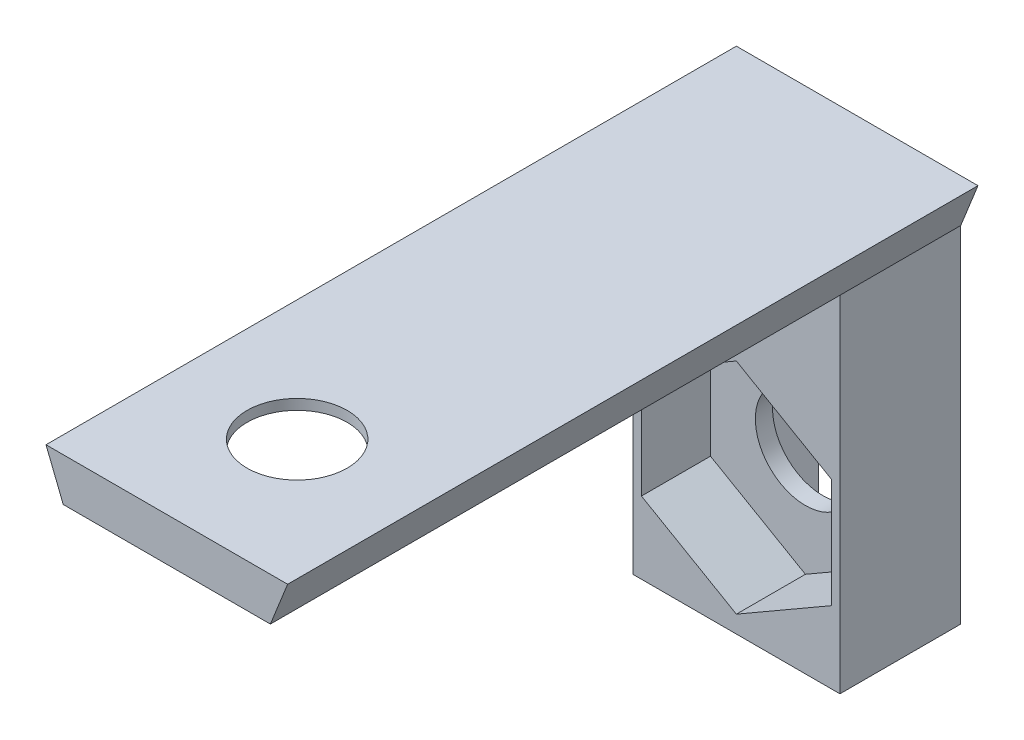
ISO-10303-21;
HEADER;
FILE_DESCRIPTION(('STEP AP214'),'2;1');
FILE_NAME('part.step','',(''),(''),'','','');
FILE_SCHEMA(('AUTOMOTIVE_DESIGN { 1 0 10303 214 1 1 1 1 }'));
ENDSEC;
DATA;
#1=APPLICATION_CONTEXT('core data for automotive mechanical design processes');
#2=APPLICATION_PROTOCOL_DEFINITION('international standard','automotive_design',2000,#1);
#3=PRODUCT_CONTEXT('',#1,'mechanical');
#4=PRODUCT('Part','Part','',(#3));
#5=PRODUCT_RELATED_PRODUCT_CATEGORY('part','',(#4));
#6=PRODUCT_DEFINITION_FORMATION('','',#4);
#7=PRODUCT_DEFINITION_CONTEXT('part definition',#1,'design');
#8=PRODUCT_DEFINITION('design','',#6,#7);
#9=PRODUCT_DEFINITION_SHAPE('','',#8);
#10=(LENGTH_UNIT() NAMED_UNIT(*) SI_UNIT(.MILLI.,.METRE.));
#11=(NAMED_UNIT(*) PLANE_ANGLE_UNIT() SI_UNIT($,.RADIAN.));
#12=(NAMED_UNIT(*) SI_UNIT($,.STERADIAN.) SOLID_ANGLE_UNIT());
#13=UNCERTAINTY_MEASURE_WITH_UNIT(LENGTH_MEASURE(1.E-05),#10,'distance_accuracy_value','');
#14=(GEOMETRIC_REPRESENTATION_CONTEXT(3) GLOBAL_UNCERTAINTY_ASSIGNED_CONTEXT((#13)) GLOBAL_UNIT_ASSIGNED_CONTEXT((#10,
#11,#12)) REPRESENTATION_CONTEXT('',''));
#15=CARTESIAN_POINT('',(0.,0.,0.));
#16=DIRECTION('',(0.,0.,1.));
#17=DIRECTION('',(1.,0.,0.));
#18=AXIS2_PLACEMENT_3D('',#15,#16,#17);
#19=CARTESIAN_POINT('',(0.,7.35,-3.501));
#20=DIRECTION('',(0.,0.,1.));
#21=DIRECTION('',(1.,0.,0.));
#22=AXIS2_PLACEMENT_3D('',#19,#20,#21);
#23=CYLINDRICAL_SURFACE('',#22,2.9);
#24=CARTESIAN_POINT('',(0.,7.35,-1.5));
#25=DIRECTION('',(0.,0.,1.));
#26=DIRECTION('',(1.,0.,0.));
#27=AXIS2_PLACEMENT_3D('',#24,#25,#26);
#28=CIRCLE('',#27,2.9);
#29=CARTESIAN_POINT('',(2.9,7.35,-1.5));
#30=VERTEX_POINT('',#29);
#31=EDGE_CURVE('E379',#30,#30,#28,.F.);
#32=CARTESIAN_POINT('',(0.,7.35,-0.500000000000002));
#33=DIRECTION('',(0.,0.,1.));
#34=DIRECTION('',(1.,0.,0.));
#35=AXIS2_PLACEMENT_3D('',#32,#33,#34);
#36=CIRCLE('',#35,2.9);
#37=CARTESIAN_POINT('',(2.9,7.35,-0.500000000000003));
#38=VERTEX_POINT('',#37);
#39=EDGE_CURVE('E43',#38,#38,#36,.F.);
#40=CARTESIAN_POINT('',(2.9,7.35,-1.5));
#41=CARTESIAN_POINT('',(2.9,7.35,-1.48958333333334));
#42=CARTESIAN_POINT('',(2.9,7.35,-1.47916666666667));
#43=CARTESIAN_POINT('',(2.9,7.35,-1.45833333333334));
#44=CARTESIAN_POINT('',(2.9,7.35,-1.44791666666667));
#45=CARTESIAN_POINT('',(2.9,7.35,-1.42708333333334));
#46=CARTESIAN_POINT('',(2.9,7.35,-1.41666666666667));
#47=CARTESIAN_POINT('',(2.9,7.35,-1.39583333333334));
#48=CARTESIAN_POINT('',(2.9,7.35,-1.38541666666667));
#49=CARTESIAN_POINT('',(2.9,7.35,-1.36458333333334));
#50=CARTESIAN_POINT('',(2.9,7.35,-1.35416666666667));
#51=CARTESIAN_POINT('',(2.9,7.35,-1.33333333333334));
#52=CARTESIAN_POINT('',(2.9,7.35,-1.32291666666667));
#53=CARTESIAN_POINT('',(2.9,7.35,-1.30208333333334));
#54=CARTESIAN_POINT('',(2.9,7.35,-1.29166666666667));
#55=CARTESIAN_POINT('',(2.9,7.35,-1.27083333333334));
#56=CARTESIAN_POINT('',(2.9,7.35,-1.26041666666667));
#57=CARTESIAN_POINT('',(2.9,7.35,-1.23958333333334));
#58=CARTESIAN_POINT('',(2.9,7.35,-1.22916666666667));
#59=CARTESIAN_POINT('',(2.9,7.35,-1.20833333333334));
#60=CARTESIAN_POINT('',(2.9,7.35,-1.19791666666667));
#61=CARTESIAN_POINT('',(2.9,7.35,-1.17708333333334));
#62=CARTESIAN_POINT('',(2.9,7.35,-1.16666666666667));
#63=CARTESIAN_POINT('',(2.9,7.35,-1.14583333333334));
#64=CARTESIAN_POINT('',(2.9,7.35,-1.13541666666667));
#65=CARTESIAN_POINT('',(2.9,7.35,-1.11458333333334));
#66=CARTESIAN_POINT('',(2.9,7.35,-1.10416666666667));
#67=CARTESIAN_POINT('',(2.9,7.35,-1.08333333333334));
#68=CARTESIAN_POINT('',(2.9,7.35,-1.07291666666667));
#69=CARTESIAN_POINT('',(2.9,7.35,-1.05208333333334));
#70=CARTESIAN_POINT('',(2.9,7.35,-1.04166666666667));
#71=CARTESIAN_POINT('',(2.9,7.35,-1.02083333333334));
#72=CARTESIAN_POINT('',(2.9,7.35,-1.01041666666667));
#73=CARTESIAN_POINT('',(2.9,7.35,-0.989583333333336));
#74=CARTESIAN_POINT('',(2.9,7.35,-0.979166666666669));
#75=CARTESIAN_POINT('',(2.9,7.35,-0.958333333333335));
#76=CARTESIAN_POINT('',(2.9,7.35,-0.947916666666669));
#77=CARTESIAN_POINT('',(2.9,7.35,-0.927083333333335));
#78=CARTESIAN_POINT('',(2.9,7.35,-0.916666666666669));
#79=CARTESIAN_POINT('',(2.9,7.35,-0.895833333333335));
#80=CARTESIAN_POINT('',(2.9,7.35,-0.885416666666669));
#81=CARTESIAN_POINT('',(2.9,7.35,-0.864583333333335));
#82=CARTESIAN_POINT('',(2.9,7.35,-0.854166666666669));
#83=CARTESIAN_POINT('',(2.9,7.35,-0.833333333333336));
#84=CARTESIAN_POINT('',(2.9,7.35,-0.822916666666669));
#85=CARTESIAN_POINT('',(2.9,7.35,-0.802083333333336));
#86=CARTESIAN_POINT('',(2.9,7.35,-0.791666666666669));
#87=CARTESIAN_POINT('',(2.9,7.35,-0.770833333333336));
#88=CARTESIAN_POINT('',(2.9,7.35,-0.760416666666669));
#89=CARTESIAN_POINT('',(2.9,7.35,-0.739583333333336));
#90=CARTESIAN_POINT('',(2.9,7.35,-0.729166666666669));
#91=CARTESIAN_POINT('',(2.9,7.35,-0.708333333333336));
#92=CARTESIAN_POINT('',(2.9,7.35,-0.697916666666669));
#93=CARTESIAN_POINT('',(2.9,7.35,-0.677083333333336));
#94=CARTESIAN_POINT('',(2.9,7.35,-0.666666666666669));
#95=CARTESIAN_POINT('',(2.9,7.35,-0.645833333333336));
#96=CARTESIAN_POINT('',(2.9,7.35,-0.635416666666669));
#97=CARTESIAN_POINT('',(2.9,7.35,-0.614583333333336));
#98=CARTESIAN_POINT('',(2.9,7.35,-0.604166666666669));
#99=CARTESIAN_POINT('',(2.9,7.35,-0.583333333333336));
#100=CARTESIAN_POINT('',(2.9,7.35,-0.572916666666669));
#101=CARTESIAN_POINT('',(2.9,7.35,-0.552083333333336));
#102=CARTESIAN_POINT('',(2.9,7.35,-0.541666666666669));
#103=CARTESIAN_POINT('',(2.9,7.35,-0.520833333333336));
#104=CARTESIAN_POINT('',(2.9,7.35,-0.510416666666669));
#105=CARTESIAN_POINT('',(2.9,7.35,-0.500000000000003));
#106=B_SPLINE_CURVE_WITH_KNOTS('',3,(#40,#41,#42,#43,#44,#45,#46,#47,#48,#49,#50,#51,#52,#53,
#54,#55,#56,#57,#58,#59,#60,#61,#62,#63,#64,#65,#66,#67,#68,#69,#70,#71,#72,#73,#74,#75,#76,#77,
#78,#79,#80,#81,#82,#83,#84,#85,#86,#87,#88,#89,#90,#91,#92,#93,#94,#95,#96,#97,#98,#99,#100,
#101,#102,#103,#104,#105),.UNSPECIFIED.,.F.,.F.,(4,2,2,2,2,2,2,2,2,2,2,2,2,2,2,2,2,2,2,2,2,2,2,
2,2,2,2,2,2,2,2,2,4),(0.,0.03125,0.0625000000000001,0.0937500000000001,0.125,0.15625,0.1875,
0.21875,0.25,0.28125,0.3125,0.34375,0.374999999999999,0.40625,0.4375,0.46875,0.5,0.53125,0.5625,
0.59375,0.625,0.65625,0.687499999999999,0.718749999999999,0.749999999999999,0.781249999999999,
0.812499999999999,0.843749999999999,0.874999999999999,0.906249999999999,0.937499999999999,
0.968749999999999,0.999999999999999),.UNSPECIFIED.);
#107=EDGE_CURVE('BSEAM39',#30,#38,#106,.T.);
#108=ORIENTED_EDGE('',*,*,#31,.T.);
#109=ORIENTED_EDGE('',*,*,#39,.F.);
#110=ORIENTED_EDGE('',*,*,#107,.T.);
#111=ORIENTED_EDGE('',*,*,#107,.F.);
#112=EDGE_LOOP('',(#108,#110,#109,#111));
#113=FACE_BOUND('',#112,.T.);
#114=ADVANCED_FACE('F39',(#113),#23,.F.);
#115=CARTESIAN_POINT('',(6.,20.,3.5));
#116=DIRECTION('',(-1.,0.,0.));
#117=DIRECTION('',(0.,0.,1.));
#118=AXIS2_PLACEMENT_3D('',#115,#116,#117);
#119=PLANE('',#118);
#120=DIRECTION('',(0.,0.,-1.));
#121=VECTOR('',#120,1.);
#122=CARTESIAN_POINT('',(6.,0.,3.5));
#123=LINE('',#122,#121);
#124=CARTESIAN_POINT('',(6.,0.,3.5));
#125=VERTEX_POINT('',#124);
#126=CARTESIAN_POINT('',(6.,0.,-3.5));
#127=VERTEX_POINT('',#126);
#128=EDGE_CURVE('E411',#125,#127,#123,.T.);
#129=ORIENTED_EDGE('',*,*,#128,.T.);
#130=DIRECTION('',(0.,-1.,0.));
#131=VECTOR('',#130,1.);
#132=CARTESIAN_POINT('',(6.,20.,-3.5));
#133=LINE('',#132,#131);
#134=CARTESIAN_POINT('',(6.,20.,-3.5));
#135=VERTEX_POINT('',#134);
#136=EDGE_CURVE('E11',#135,#127,#133,.T.);
#137=ORIENTED_EDGE('',*,*,#136,.F.);
#138=DIRECTION('',(0.,0.,-1.));
#139=VECTOR('',#138,1.);
#140=CARTESIAN_POINT('',(6.,20.,3.5));
#141=LINE('',#140,#139);
#142=CARTESIAN_POINT('',(6.,20.,3.5));
#143=VERTEX_POINT('',#142);
#144=EDGE_CURVE('E420',#143,#135,#141,.T.);
#145=ORIENTED_EDGE('',*,*,#144,.F.);
#146=DIRECTION('',(0.,-1.,0.));
#147=VECTOR('',#146,1.);
#148=CARTESIAN_POINT('',(6.,20.,3.5));
#149=LINE('',#148,#147);
#150=EDGE_CURVE('E431',#143,#125,#149,.T.);
#151=ORIENTED_EDGE('',*,*,#150,.T.);
#152=EDGE_LOOP('',(#129,#137,#145,#151));
#153=FACE_BOUND('',#152,.T.);
#154=ADVANCED_FACE('F41',(#153),#119,.F.);
#155=CARTESIAN_POINT('',(-6.,20.,-3.5));
#156=DIRECTION('',(0.,0.,1.));
#157=DIRECTION('',(1.,0.,0.));
#158=AXIS2_PLACEMENT_3D('',#155,#156,#157);
#159=PLANE('',#158);
#160=DIRECTION('',(-1.,0.,0.));
#161=VECTOR('',#160,1.);
#162=CARTESIAN_POINT('',(-7.,22.5,-3.5));
#163=LINE('',#162,#161);
#164=CARTESIAN_POINT('',(7.,22.5,-3.5));
#165=VERTEX_POINT('',#164);
#166=CARTESIAN_POINT('',(-7.,22.5,-3.5));
#167=VERTEX_POINT('',#166);
#168=EDGE_CURVE('E305',#165,#167,#163,.T.);
#169=ORIENTED_EDGE('',*,*,#168,.F.);
#170=DIRECTION('',(0.371390676354104,0.928476690885259,0.));
#171=VECTOR('',#170,1.);
#172=CARTESIAN_POINT('',(7.,22.5,-3.5));
#173=LINE('',#172,#171);
#174=EDGE_CURVE('E273',#135,#165,#173,.T.);
#175=ORIENTED_EDGE('',*,*,#174,.F.);
#176=ORIENTED_EDGE('',*,*,#136,.T.);
#177=DIRECTION('',(-1.,0.,0.));
#178=VECTOR('',#177,1.);
#179=CARTESIAN_POINT('',(-6.,0.,-3.5));
#180=LINE('',#179,#178);
#181=CARTESIAN_POINT('',(2.25,0.,-3.5));
#182=VERTEX_POINT('',#181);
#183=EDGE_CURVE('E436',#127,#182,#180,.T.);
#184=ORIENTED_EDGE('',*,*,#183,.T.);
#185=DIRECTION('',(0.,1.,0.));
#186=VECTOR('',#185,1.);
#187=CARTESIAN_POINT('',(2.25,0.,-3.5));
#188=LINE('',#187,#186);
#189=CARTESIAN_POINT('',(2.25,20.,-3.5));
#190=VERTEX_POINT('',#189);
#191=EDGE_CURVE('E407',#182,#190,#188,.T.);
#192=ORIENTED_EDGE('',*,*,#191,.T.);
#193=DIRECTION('',(-1.,0.,0.));
#194=VECTOR('',#193,1.);
#195=CARTESIAN_POINT('',(-7.,20.,-3.5));
#196=LINE('',#195,#194);
#197=CARTESIAN_POINT('',(-2.25,20.,-3.5));
#198=VERTEX_POINT('',#197);
#199=EDGE_CURVE('E297',#190,#198,#196,.T.);
#200=ORIENTED_EDGE('',*,*,#199,.T.);
#201=DIRECTION('',(0.,1.,0.));
#202=VECTOR('',#201,1.);
#203=CARTESIAN_POINT('',(-2.25,0.,-3.5));
#204=LINE('',#203,#202);
#205=CARTESIAN_POINT('',(-2.25,0.,-3.5));
#206=VERTEX_POINT('',#205);
#207=EDGE_CURVE('E397',#206,#198,#204,.T.);
#208=ORIENTED_EDGE('',*,*,#207,.F.);
#209=CARTESIAN_POINT('',(-6.,0.,-3.5));
#210=VERTEX_POINT('',#209);
#211=EDGE_CURVE('E435',#206,#210,#180,.T.);
#212=ORIENTED_EDGE('',*,*,#211,.T.);
#213=DIRECTION('',(0.,-1.,0.));
#214=VECTOR('',#213,1.);
#215=CARTESIAN_POINT('',(-6.,20.,-3.5));
#216=LINE('',#215,#214);
#217=CARTESIAN_POINT('',(-6.,20.,-3.5));
#218=VERTEX_POINT('',#217);
#219=EDGE_CURVE('E49',#218,#210,#216,.T.);
#220=ORIENTED_EDGE('',*,*,#219,.F.);
#221=DIRECTION('',(0.371390676354104,-0.928476690885259,0.));
#222=VECTOR('',#221,1.);
#223=CARTESIAN_POINT('',(-6.,20.,-3.5));
#224=LINE('',#223,#222);
#225=EDGE_CURVE('E261',#167,#218,#224,.T.);
#226=ORIENTED_EDGE('',*,*,#225,.F.);
#227=EDGE_LOOP('',(#169,#175,#176,#184,#192,#200,#208,#212,#220,#226));
#228=FACE_BOUND('',#227,.T.);
#229=ADVANCED_FACE('F490',(#228),#159,.F.);
#230=CARTESIAN_POINT('',(-6.,20.,3.5));
#231=DIRECTION('',(1.,0.,0.));
#232=DIRECTION('',(0.,0.,-1.));
#233=AXIS2_PLACEMENT_3D('',#230,#231,#232);
#234=PLANE('',#233);
#235=DIRECTION('',(0.,0.,1.));
#236=VECTOR('',#235,1.);
#237=CARTESIAN_POINT('',(-6.,0.,3.5));
#238=LINE('',#237,#236);
#239=CARTESIAN_POINT('',(-6.,0.,3.5));
#240=VERTEX_POINT('',#239);
#241=EDGE_CURVE('E440',#210,#240,#238,.T.);
#242=ORIENTED_EDGE('',*,*,#241,.T.);
#243=DIRECTION('',(0.,-1.,0.));
#244=VECTOR('',#243,1.);
#245=CARTESIAN_POINT('',(-6.,20.,3.5));
#246=LINE('',#245,#244);
#247=CARTESIAN_POINT('',(-6.,20.,3.5));
#248=VERTEX_POINT('',#247);
#249=EDGE_CURVE('E448',#248,#240,#246,.T.);
#250=ORIENTED_EDGE('',*,*,#249,.F.);
#251=DIRECTION('',(0.,0.,1.));
#252=VECTOR('',#251,1.);
#253=CARTESIAN_POINT('',(-6.,20.,3.5));
#254=LINE('',#253,#252);
#255=EDGE_CURVE('E423',#218,#248,#254,.T.);
#256=ORIENTED_EDGE('',*,*,#255,.F.);
#257=ORIENTED_EDGE('',*,*,#219,.T.);
#258=EDGE_LOOP('',(#242,#250,#256,#257));
#259=FACE_BOUND('',#258,.T.);
#260=ADVANCED_FACE('F458',(#259),#234,.F.);
#261=CARTESIAN_POINT('',(-6.,20.,3.5));
#262=DIRECTION('',(0.,0.,-1.));
#263=DIRECTION('',(-1.,0.,0.));
#264=AXIS2_PLACEMENT_3D('',#261,#262,#263);
#265=PLANE('',#264);
#266=DIRECTION('',(-0.866025403784438,-0.5,0.));
#267=VECTOR('',#266,1.);
#268=CARTESIAN_POINT('',(0.,13.7008529610859,3.5));
#269=LINE('',#268,#267);
#270=CARTESIAN_POINT('',(0.,13.7008529610859,3.5));
#271=VERTEX_POINT('',#270);
#272=CARTESIAN_POINT('',(-5.5,10.5254264805429,3.5));
#273=VERTEX_POINT('',#272);
#274=EDGE_CURVE('E343',#271,#273,#269,.T.);
#275=ORIENTED_EDGE('',*,*,#274,.F.);
#276=DIRECTION('',(-0.866025403784439,0.5,0.));
#277=VECTOR('',#276,1.);
#278=CARTESIAN_POINT('',(5.5,10.5254264805429,3.5));
#279=LINE('',#278,#277);
#280=CARTESIAN_POINT('',(5.5,10.5254264805429,3.5));
#281=VERTEX_POINT('',#280);
#282=EDGE_CURVE('E64',#281,#271,#279,.T.);
#283=ORIENTED_EDGE('',*,*,#282,.F.);
#284=DIRECTION('',(0.,1.,0.));
#285=VECTOR('',#284,1.);
#286=CARTESIAN_POINT('',(5.5,4.17457351945706,3.5));
#287=LINE('',#286,#285);
#288=CARTESIAN_POINT('',(5.5,4.17457351945706,3.5));
#289=VERTEX_POINT('',#288);
#290=EDGE_CURVE('E320',#289,#281,#287,.T.);
#291=ORIENTED_EDGE('',*,*,#290,.F.);
#292=DIRECTION('',(0.866025403784438,0.5,0.));
#293=VECTOR('',#292,1.);
#294=CARTESIAN_POINT('',(0.,0.999147038914115,3.5));
#295=LINE('',#294,#293);
#296=CARTESIAN_POINT('',(0.,0.999147038914115,3.5));
#297=VERTEX_POINT('',#296);
#298=EDGE_CURVE('E355',#297,#289,#295,.T.);
#299=ORIENTED_EDGE('',*,*,#298,.F.);
#300=DIRECTION('',(0.866025403784438,-0.5,0.));
#301=VECTOR('',#300,1.);
#302=CARTESIAN_POINT('',(-5.5,4.17457351945706,3.5));
#303=LINE('',#302,#301);
#304=CARTESIAN_POINT('',(-5.5,4.17457351945706,3.5));
#305=VERTEX_POINT('',#304);
#306=EDGE_CURVE('E351',#305,#297,#303,.T.);
#307=ORIENTED_EDGE('',*,*,#306,.F.);
#308=DIRECTION('',(0.,-1.,0.));
#309=VECTOR('',#308,1.);
#310=CARTESIAN_POINT('',(-5.5,10.5254264805429,3.5));
#311=LINE('',#310,#309);
#312=EDGE_CURVE('E347',#273,#305,#311,.T.);
#313=ORIENTED_EDGE('',*,*,#312,.F.);
#314=EDGE_LOOP('',(#275,#283,#291,#299,#307,#313));
#315=FACE_BOUND('',#314,.T.);
#316=DIRECTION('',(1.,0.,0.));
#317=VECTOR('',#316,1.);
#318=CARTESIAN_POINT('',(-6.,0.,3.5));
#319=LINE('',#318,#317);
#320=EDGE_CURVE('E424',#240,#125,#319,.T.);
#321=ORIENTED_EDGE('',*,*,#320,.T.);
#322=ORIENTED_EDGE('',*,*,#150,.F.);
#323=DIRECTION('',(1.,0.,0.));
#324=VECTOR('',#323,1.);
#325=CARTESIAN_POINT('',(-6.,20.,3.5));
#326=LINE('',#325,#324);
#327=EDGE_CURVE('E427',#248,#143,#326,.T.);
#328=ORIENTED_EDGE('',*,*,#327,.F.);
#329=ORIENTED_EDGE('',*,*,#249,.T.);
#330=EDGE_LOOP('',(#321,#322,#328,#329));
#331=FACE_BOUND('',#330,.T.);
#332=ADVANCED_FACE('F469',(#315,#331),#265,.F.);
#333=CARTESIAN_POINT('',(0.,0.,0.));
#334=DIRECTION('',(0.,-1.,0.));
#335=DIRECTION('',(0.,0.,-1.));
#336=AXIS2_PLACEMENT_3D('',#333,#334,#335);
#337=PLANE('',#336);
#338=DIRECTION('',(-0.707106781186548,0.,-0.707106781186547));
#339=VECTOR('',#338,1.);
#340=CARTESIAN_POINT('',(2.25,0.,-3.5));
#341=LINE('',#340,#339);
#342=CARTESIAN_POINT('',(4.25,0.,-1.5));
#343=VERTEX_POINT('',#342);
#344=EDGE_CURVE('E393',#343,#182,#341,.T.);
#345=ORIENTED_EDGE('',*,*,#344,.T.);
#346=ORIENTED_EDGE('',*,*,#183,.F.);
#347=ORIENTED_EDGE('',*,*,#128,.F.);
#348=ORIENTED_EDGE('',*,*,#320,.F.);
#349=ORIENTED_EDGE('',*,*,#241,.F.);
#350=ORIENTED_EDGE('',*,*,#211,.F.);
#351=DIRECTION('',(-0.707106781186547,0.,0.707106781186548));
#352=VECTOR('',#351,1.);
#353=CARTESIAN_POINT('',(-4.25,0.,-1.5));
#354=LINE('',#353,#352);
#355=CARTESIAN_POINT('',(-4.25,0.,-1.5));
#356=VERTEX_POINT('',#355);
#357=EDGE_CURVE('E384',#206,#356,#354,.T.);
#358=ORIENTED_EDGE('',*,*,#357,.T.);
#359=DIRECTION('',(1.,0.,0.));
#360=VECTOR('',#359,1.);
#361=CARTESIAN_POINT('',(0.,0.,-1.5));
#362=LINE('',#361,#360);
#363=EDGE_CURVE('E388',#356,#343,#362,.T.);
#364=ORIENTED_EDGE('',*,*,#363,.T.);
#365=EDGE_LOOP('',(#345,#346,#347,#348,#349,#350,#358,#364));
#366=FACE_BOUND('',#365,.T.);
#367=ADVANCED_FACE('F465',(#366),#337,.T.);
#368=CARTESIAN_POINT('',(2.25,0.,-3.5));
#369=DIRECTION('',(0.707106781186547,0.,-0.707106781186548));
#370=DIRECTION('',(-0.707106781186548,0.,-0.707106781186547));
#371=AXIS2_PLACEMENT_3D('',#368,#369,#370);
#372=PLANE('',#371);
#373=DIRECTION('',(-0.707106781186548,0.,-0.707106781186547));
#374=VECTOR('',#373,1.);
#375=CARTESIAN_POINT('',(2.25,20.,-3.5));
#376=LINE('',#375,#374);
#377=CARTESIAN_POINT('',(4.25,20.,-1.5));
#378=VERTEX_POINT('',#377);
#379=EDGE_CURVE('E389',#378,#190,#376,.T.);
#380=ORIENTED_EDGE('',*,*,#379,.T.);
#381=ORIENTED_EDGE('',*,*,#191,.F.);
#382=ORIENTED_EDGE('',*,*,#344,.F.);
#383=DIRECTION('',(0.,1.,0.));
#384=VECTOR('',#383,1.);
#385=CARTESIAN_POINT('',(4.25,0.,-1.5));
#386=LINE('',#385,#384);
#387=EDGE_CURVE('E412',#343,#378,#386,.T.);
#388=ORIENTED_EDGE('',*,*,#387,.T.);
#389=EDGE_LOOP('',(#380,#381,#382,#388));
#390=FACE_BOUND('',#389,.T.);
#391=ADVANCED_FACE('F513',(#390),#372,.F.);
#392=CARTESIAN_POINT('',(0.,0.,-1.5));
#393=DIRECTION('',(0.,0.,1.));
#394=DIRECTION('',(1.,0.,0.));
#395=AXIS2_PLACEMENT_3D('',#392,#393,#394);
#396=PLANE('',#395);
#397=ORIENTED_EDGE('',*,*,#31,.F.);
#398=EDGE_LOOP('',(#397));
#399=FACE_BOUND('',#398,.T.);
#400=DIRECTION('',(1.,0.,0.));
#401=VECTOR('',#400,1.);
#402=CARTESIAN_POINT('',(0.,20.,-1.5));
#403=LINE('',#402,#401);
#404=CARTESIAN_POINT('',(-4.25,20.,-1.5));
#405=VERTEX_POINT('',#404);
#406=EDGE_CURVE('E401',#405,#378,#403,.T.);
#407=ORIENTED_EDGE('',*,*,#406,.T.);
#408=ORIENTED_EDGE('',*,*,#387,.F.);
#409=ORIENTED_EDGE('',*,*,#363,.F.);
#410=DIRECTION('',(0.,1.,0.));
#411=VECTOR('',#410,1.);
#412=CARTESIAN_POINT('',(-4.25,0.,-1.5));
#413=LINE('',#412,#411);
#414=EDGE_CURVE('E415',#356,#405,#413,.T.);
#415=ORIENTED_EDGE('',*,*,#414,.T.);
#416=EDGE_LOOP('',(#407,#408,#409,#415));
#417=FACE_BOUND('',#416,.T.);
#418=ADVANCED_FACE('F516',(#399,#417),#396,.F.);
#419=CARTESIAN_POINT('',(-4.25,0.,-1.5));
#420=DIRECTION('',(-0.707106781186548,0.,-0.707106781186547));
#421=DIRECTION('',(-0.707106781186547,0.,0.707106781186548));
#422=AXIS2_PLACEMENT_3D('',#419,#420,#421);
#423=PLANE('',#422);
#424=DIRECTION('',(-0.707106781186547,0.,0.707106781186548));
#425=VECTOR('',#424,1.);
#426=CARTESIAN_POINT('',(-4.25,20.,-1.5));
#427=LINE('',#426,#425);
#428=EDGE_CURVE('E383',#198,#405,#427,.T.);
#429=ORIENTED_EDGE('',*,*,#428,.T.);
#430=ORIENTED_EDGE('',*,*,#414,.F.);
#431=ORIENTED_EDGE('',*,*,#357,.F.);
#432=ORIENTED_EDGE('',*,*,#207,.T.);
#433=EDGE_LOOP('',(#429,#430,#431,#432));
#434=FACE_BOUND('',#433,.T.);
#435=ADVANCED_FACE('F520',(#434),#423,.F.);
#436=CARTESIAN_POINT('',(0.,0.,-0.500000000000002));
#437=DIRECTION('',(0.,0.,1.));
#438=DIRECTION('',(1.,0.,0.));
#439=AXIS2_PLACEMENT_3D('',#436,#437,#438);
#440=PLANE('',#439);
#441=DIRECTION('',(-0.866025403784439,0.5,0.));
#442=VECTOR('',#441,1.);
#443=CARTESIAN_POINT('',(5.5,10.5254264805429,-0.500000000000002));
#444=LINE('',#443,#442);
#445=CARTESIAN_POINT('',(5.5,10.5254264805429,-0.500000000000002));
#446=VERTEX_POINT('',#445);
#447=CARTESIAN_POINT('',(0.,13.7008529610859,-0.500000000000002));
#448=VERTEX_POINT('',#447);
#449=EDGE_CURVE('E315',#446,#448,#444,.T.);
#450=ORIENTED_EDGE('',*,*,#449,.T.);
#451=DIRECTION('',(-0.866025403784438,-0.5,0.));
#452=VECTOR('',#451,1.);
#453=CARTESIAN_POINT('',(0.,13.7008529610859,-0.500000000000002));
#454=LINE('',#453,#452);
#455=CARTESIAN_POINT('',(-5.5,10.5254264805429,-0.500000000000002));
#456=VERTEX_POINT('',#455);
#457=EDGE_CURVE('E319',#448,#456,#454,.T.);
#458=ORIENTED_EDGE('',*,*,#457,.T.);
#459=DIRECTION('',(0.,-1.,0.));
#460=VECTOR('',#459,1.);
#461=CARTESIAN_POINT('',(-5.5,10.5254264805429,-0.500000000000002));
#462=LINE('',#461,#460);
#463=CARTESIAN_POINT('',(-5.5,4.17457351945706,-0.500000000000002));
#464=VERTEX_POINT('',#463);
#465=EDGE_CURVE('E324',#456,#464,#462,.T.);
#466=ORIENTED_EDGE('',*,*,#465,.T.);
#467=DIRECTION('',(0.866025403784438,-0.5,0.));
#468=VECTOR('',#467,1.);
#469=CARTESIAN_POINT('',(-5.5,4.17457351945706,-0.500000000000002));
#470=LINE('',#469,#468);
#471=CARTESIAN_POINT('',(0.,0.999147038914115,-0.500000000000002));
#472=VERTEX_POINT('',#471);
#473=EDGE_CURVE('E328',#464,#472,#470,.T.);
#474=ORIENTED_EDGE('',*,*,#473,.T.);
#475=DIRECTION('',(0.866025403784438,0.5,0.));
#476=VECTOR('',#475,1.);
#477=CARTESIAN_POINT('',(0.,0.999147038914115,-0.500000000000002));
#478=LINE('',#477,#476);
#479=CARTESIAN_POINT('',(5.5,4.17457351945706,-0.500000000000002));
#480=VERTEX_POINT('',#479);
#481=EDGE_CURVE('E332',#472,#480,#478,.T.);
#482=ORIENTED_EDGE('',*,*,#481,.T.);
#483=DIRECTION('',(0.,1.,0.));
#484=VECTOR('',#483,1.);
#485=CARTESIAN_POINT('',(5.5,4.17457351945706,-0.500000000000002));
#486=LINE('',#485,#484);
#487=EDGE_CURVE('E336',#480,#446,#486,.T.);
#488=ORIENTED_EDGE('',*,*,#487,.T.);
#489=EDGE_LOOP('',(#450,#458,#466,#474,#482,#488));
#490=FACE_BOUND('',#489,.T.);
#491=ORIENTED_EDGE('',*,*,#39,.T.);
#492=EDGE_LOOP('',(#491));
#493=FACE_BOUND('',#492,.T.);
#494=ADVANCED_FACE('F524',(#490,#493),#440,.T.);
#495=CARTESIAN_POINT('',(5.5,10.5254264805429,-0.500000000000002));
#496=DIRECTION('',(0.5,0.866025403784439,0.));
#497=DIRECTION('',(-0.866025403784439,0.5,0.));
#498=AXIS2_PLACEMENT_3D('',#495,#496,#497);
#499=PLANE('',#498);
#500=ORIENTED_EDGE('',*,*,#282,.T.);
#501=DIRECTION('',(0.,0.,1.));
#502=VECTOR('',#501,1.);
#503=CARTESIAN_POINT('',(0.,13.7008529610859,-0.500000000000002));
#504=LINE('',#503,#502);
#505=EDGE_CURVE('E340',#448,#271,#504,.T.);
#506=ORIENTED_EDGE('',*,*,#505,.F.);
#507=ORIENTED_EDGE('',*,*,#449,.F.);
#508=DIRECTION('',(0.,0.,1.));
#509=VECTOR('',#508,1.);
#510=CARTESIAN_POINT('',(5.5,10.5254264805429,-0.500000000000002));
#511=LINE('',#510,#509);
#512=EDGE_CURVE('E362',#446,#281,#511,.T.);
#513=ORIENTED_EDGE('',*,*,#512,.T.);
#514=EDGE_LOOP('',(#500,#506,#507,#513));
#515=FACE_BOUND('',#514,.T.);
#516=ADVANCED_FACE('F511',(#515),#499,.F.);
#517=CARTESIAN_POINT('',(5.5,4.17457351945706,-0.500000000000002));
#518=DIRECTION('',(1.,0.,0.));
#519=DIRECTION('',(0.,0.,-1.));
#520=AXIS2_PLACEMENT_3D('',#517,#518,#519);
#521=PLANE('',#520);
#522=ORIENTED_EDGE('',*,*,#290,.T.);
#523=ORIENTED_EDGE('',*,*,#512,.F.);
#524=ORIENTED_EDGE('',*,*,#487,.F.);
#525=DIRECTION('',(0.,0.,1.));
#526=VECTOR('',#525,1.);
#527=CARTESIAN_POINT('',(5.5,4.17457351945706,-0.500000000000002));
#528=LINE('',#527,#526);
#529=EDGE_CURVE('E365',#480,#289,#528,.T.);
#530=ORIENTED_EDGE('',*,*,#529,.T.);
#531=EDGE_LOOP('',(#522,#523,#524,#530));
#532=FACE_BOUND('',#531,.T.);
#533=ADVANCED_FACE('F577',(#532),#521,.F.);
#534=CARTESIAN_POINT('',(0.,0.999147038914115,-0.500000000000002));
#535=DIRECTION('',(0.5,-0.866025403784439,0.));
#536=DIRECTION('',(0.866025403784439,0.5,0.));
#537=AXIS2_PLACEMENT_3D('',#534,#535,#536);
#538=PLANE('',#537);
#539=ORIENTED_EDGE('',*,*,#298,.T.);
#540=ORIENTED_EDGE('',*,*,#529,.F.);
#541=ORIENTED_EDGE('',*,*,#481,.F.);
#542=DIRECTION('',(0.,0.,1.));
#543=VECTOR('',#542,1.);
#544=CARTESIAN_POINT('',(0.,0.999147038914115,-0.500000000000002));
#545=LINE('',#544,#543);
#546=EDGE_CURVE('E368',#472,#297,#545,.T.);
#547=ORIENTED_EDGE('',*,*,#546,.T.);
#548=EDGE_LOOP('',(#539,#540,#541,#547));
#549=FACE_BOUND('',#548,.T.);
#550=ADVANCED_FACE('F583',(#549),#538,.F.);
#551=CARTESIAN_POINT('',(-5.5,4.17457351945706,-0.500000000000002));
#552=DIRECTION('',(-0.5,-0.866025403784439,0.));
#553=DIRECTION('',(0.866025403784438,-0.5,0.));
#554=AXIS2_PLACEMENT_3D('',#551,#552,#553);
#555=PLANE('',#554);
#556=ORIENTED_EDGE('',*,*,#306,.T.);
#557=ORIENTED_EDGE('',*,*,#546,.F.);
#558=ORIENTED_EDGE('',*,*,#473,.F.);
#559=DIRECTION('',(0.,0.,1.));
#560=VECTOR('',#559,1.);
#561=CARTESIAN_POINT('',(-5.5,4.17457351945706,-0.500000000000002));
#562=LINE('',#561,#560);
#563=EDGE_CURVE('E371',#464,#305,#562,.T.);
#564=ORIENTED_EDGE('',*,*,#563,.T.);
#565=EDGE_LOOP('',(#556,#557,#558,#564));
#566=FACE_BOUND('',#565,.T.);
#567=ADVANCED_FACE('F591',(#566),#555,.F.);
#568=CARTESIAN_POINT('',(-5.5,10.5254264805429,-0.500000000000002));
#569=DIRECTION('',(-1.,0.,0.));
#570=DIRECTION('',(0.,0.,1.));
#571=AXIS2_PLACEMENT_3D('',#568,#569,#570);
#572=PLANE('',#571);
#573=ORIENTED_EDGE('',*,*,#312,.T.);
#574=ORIENTED_EDGE('',*,*,#563,.F.);
#575=ORIENTED_EDGE('',*,*,#465,.F.);
#576=DIRECTION('',(0.,0.,1.));
#577=VECTOR('',#576,1.);
#578=CARTESIAN_POINT('',(-5.5,10.5254264805429,-0.500000000000002));
#579=LINE('',#578,#577);
#580=EDGE_CURVE('E374',#456,#273,#579,.T.);
#581=ORIENTED_EDGE('',*,*,#580,.T.);
#582=EDGE_LOOP('',(#573,#574,#575,#581));
#583=FACE_BOUND('',#582,.T.);
#584=ADVANCED_FACE('F599',(#583),#572,.F.);
#585=CARTESIAN_POINT('',(0.,13.7008529610859,-0.500000000000002));
#586=DIRECTION('',(-0.5,0.866025403784438,0.));
#587=DIRECTION('',(-0.866025403784439,-0.5,0.));
#588=AXIS2_PLACEMENT_3D('',#585,#586,#587);
#589=PLANE('',#588);
#590=ORIENTED_EDGE('',*,*,#274,.T.);
#591=ORIENTED_EDGE('',*,*,#580,.F.);
#592=ORIENTED_EDGE('',*,*,#457,.F.);
#593=ORIENTED_EDGE('',*,*,#505,.T.);
#594=EDGE_LOOP('',(#590,#591,#592,#593));
#595=FACE_BOUND('',#594,.T.);
#596=ADVANCED_FACE('F607',(#595),#589,.F.);
#597=CARTESIAN_POINT('',(0.,20.,0.));
#598=DIRECTION('',(0.,1.,0.));
#599=DIRECTION('',(0.,0.,1.));
#600=AXIS2_PLACEMENT_3D('',#597,#598,#599);
#601=PLANE('',#600);
#602=DIRECTION('',(0.866025403784439,0.,0.5));
#603=VECTOR('',#602,1.);
#604=CARTESIAN_POINT('',(0.,20.,22.5991470389141));
#605=LINE('',#604,#603);
#606=CARTESIAN_POINT('',(0.,20.,22.5991470389141));
#607=VERTEX_POINT('',#606);
#608=CARTESIAN_POINT('',(5.50000000000001,20.,25.7745735194571));
#609=VERTEX_POINT('',#608);
#610=EDGE_CURVE('E243',#607,#609,#605,.T.);
#611=ORIENTED_EDGE('',*,*,#610,.F.);
#612=DIRECTION('',(0.866025403784439,0.,-0.5));
#613=VECTOR('',#612,1.);
#614=CARTESIAN_POINT('',(-5.5,20.,25.7745735194571));
#615=LINE('',#614,#613);
#616=CARTESIAN_POINT('',(-5.5,20.,25.7745735194571));
#617=VERTEX_POINT('',#616);
#618=EDGE_CURVE('E56',#617,#607,#615,.T.);
#619=ORIENTED_EDGE('',*,*,#618,.F.);
#620=DIRECTION('',(0.,0.,-1.));
#621=VECTOR('',#620,1.);
#622=CARTESIAN_POINT('',(-5.5,20.,32.1254264805429));
#623=LINE('',#622,#621);
#624=CARTESIAN_POINT('',(-5.5,20.,32.1254264805429));
#625=VERTEX_POINT('',#624);
#626=EDGE_CURVE('E220',#625,#617,#623,.T.);
#627=ORIENTED_EDGE('',*,*,#626,.F.);
#628=DIRECTION('',(-0.866025403784439,0.,-0.5));
#629=VECTOR('',#628,1.);
#630=CARTESIAN_POINT('',(0.,20.,35.3008529610859));
#631=LINE('',#630,#629);
#632=CARTESIAN_POINT('',(0.,20.,35.3008529610859));
#633=VERTEX_POINT('',#632);
#634=EDGE_CURVE('E224',#633,#625,#631,.T.);
#635=ORIENTED_EDGE('',*,*,#634,.F.);
#636=DIRECTION('',(-0.866025403784438,0.,0.5));
#637=VECTOR('',#636,1.);
#638=CARTESIAN_POINT('',(5.5,20.,32.1254264805429));
#639=LINE('',#638,#637);
#640=CARTESIAN_POINT('',(5.5,20.,32.1254264805429));
#641=VERTEX_POINT('',#640);
#642=EDGE_CURVE('E251',#641,#633,#639,.T.);
#643=ORIENTED_EDGE('',*,*,#642,.F.);
#644=DIRECTION('',(0.,0.,1.));
#645=VECTOR('',#644,1.);
#646=CARTESIAN_POINT('',(5.50000000000001,20.,25.7745735194571));
#647=LINE('',#646,#645);
#648=EDGE_CURVE('E247',#609,#641,#647,.T.);
#649=ORIENTED_EDGE('',*,*,#648,.F.);
#650=EDGE_LOOP('',(#611,#619,#627,#635,#643,#649));
#651=FACE_BOUND('',#650,.T.);
#652=ORIENTED_EDGE('',*,*,#327,.T.);
#653=DIRECTION('',(0.,0.,-1.));
#654=VECTOR('',#653,1.);
#655=CARTESIAN_POINT('',(6.,20.,36.501));
#656=LINE('',#655,#654);
#657=CARTESIAN_POINT('',(6.,20.,36.5));
#658=VERTEX_POINT('',#657);
#659=EDGE_CURVE('E276',#658,#143,#656,.T.);
#660=ORIENTED_EDGE('',*,*,#659,.F.);
#661=DIRECTION('',(1.,0.,0.));
#662=VECTOR('',#661,1.);
#663=CARTESIAN_POINT('',(-6.99999999999999,20.,36.5));
#664=LINE('',#663,#662);
#665=CARTESIAN_POINT('',(-6.,20.,36.5));
#666=VERTEX_POINT('',#665);
#667=EDGE_CURVE('E283',#666,#658,#664,.T.);
#668=ORIENTED_EDGE('',*,*,#667,.F.);
#669=DIRECTION('',(0.,0.,-1.));
#670=VECTOR('',#669,1.);
#671=CARTESIAN_POINT('',(-6.,20.,36.501));
#672=LINE('',#671,#670);
#673=EDGE_CURVE('E286',#666,#248,#672,.T.);
#674=ORIENTED_EDGE('',*,*,#673,.T.);
#675=EDGE_LOOP('',(#652,#660,#668,#674));
#676=FACE_BOUND('',#675,.T.);
#677=ADVANCED_FACE('F478',(#651,#676),#601,.F.);
#678=CARTESIAN_POINT('',(-6.99999999999999,22.5,36.5));
#679=DIRECTION('',(0.,0.,-1.));
#680=DIRECTION('',(-1.,0.,0.));
#681=AXIS2_PLACEMENT_3D('',#678,#679,#680);
#682=PLANE('',#681);
#683=ORIENTED_EDGE('',*,*,#667,.T.);
#684=DIRECTION('',(-0.371390676354104,-0.92847669088526,0.));
#685=VECTOR('',#684,1.);
#686=CARTESIAN_POINT('',(7.,22.5,36.5));
#687=LINE('',#686,#685);
#688=CARTESIAN_POINT('',(7.,22.5,36.5));
#689=VERTEX_POINT('',#688);
#690=EDGE_CURVE('E280',#689,#658,#687,.T.);
#691=ORIENTED_EDGE('',*,*,#690,.F.);
#692=DIRECTION('',(1.,0.,0.));
#693=VECTOR('',#692,1.);
#694=CARTESIAN_POINT('',(-6.99999999999999,22.5,36.5));
#695=LINE('',#694,#693);
#696=CARTESIAN_POINT('',(-6.99999999999999,22.5,36.5));
#697=VERTEX_POINT('',#696);
#698=EDGE_CURVE('E296',#697,#689,#695,.T.);
#699=ORIENTED_EDGE('',*,*,#698,.F.);
#700=DIRECTION('',(-0.371390676354104,0.928476690885259,0.));
#701=VECTOR('',#700,1.);
#702=CARTESIAN_POINT('',(-6.,20.,36.5));
#703=LINE('',#702,#701);
#704=EDGE_CURVE('E277',#666,#697,#703,.T.);
#705=ORIENTED_EDGE('',*,*,#704,.F.);
#706=EDGE_LOOP('',(#683,#691,#699,#705));
#707=FACE_BOUND('',#706,.T.);
#708=ADVANCED_FACE('F485',(#707),#682,.F.);
#709=CARTESIAN_POINT('',(0.,22.5,0.));
#710=DIRECTION('',(0.,1.,0.));
#711=DIRECTION('',(0.,0.,1.));
#712=AXIS2_PLACEMENT_3D('',#709,#710,#711);
#713=PLANE('',#712);
#714=CARTESIAN_POINT('',(0.,22.5,28.95));
#715=DIRECTION('',(0.,1.,0.));
#716=DIRECTION('',(0.,0.,1.));
#717=AXIS2_PLACEMENT_3D('',#714,#715,#716);
#718=CIRCLE('',#717,2.9);
#719=CARTESIAN_POINT('',(0.,22.5,31.85));
#720=VERTEX_POINT('',#719);
#721=EDGE_CURVE('E227',#720,#720,#718,.F.);
#722=ORIENTED_EDGE('',*,*,#721,.T.);
#723=EDGE_LOOP('',(#722));
#724=FACE_BOUND('',#723,.T.);
#725=DIRECTION('',(0.,0.,1.));
#726=VECTOR('',#725,1.);
#727=CARTESIAN_POINT('',(-7.,22.5,-3.5));
#728=LINE('',#727,#726);
#729=EDGE_CURVE('E292',#167,#697,#728,.T.);
#730=ORIENTED_EDGE('',*,*,#729,.T.);
#731=ORIENTED_EDGE('',*,*,#698,.T.);
#732=DIRECTION('',(0.,0.,-1.));
#733=VECTOR('',#732,1.);
#734=CARTESIAN_POINT('',(7.,22.5,-3.5));
#735=LINE('',#734,#733);
#736=EDGE_CURVE('E301',#689,#165,#735,.T.);
#737=ORIENTED_EDGE('',*,*,#736,.T.);
#738=ORIENTED_EDGE('',*,*,#168,.T.);
#739=EDGE_LOOP('',(#730,#731,#737,#738));
#740=FACE_BOUND('',#739,.T.);
#741=ADVANCED_FACE('F488',(#724,#740),#713,.T.);
#742=ORIENTED_EDGE('',*,*,#379,.F.);
#743=ORIENTED_EDGE('',*,*,#406,.F.);
#744=ORIENTED_EDGE('',*,*,#428,.F.);
#745=ORIENTED_EDGE('',*,*,#199,.F.);
#746=EDGE_LOOP('',(#742,#743,#744,#745));
#747=FACE_BOUND('',#746,.T.);
#748=ADVANCED_FACE('F500',(#747),#601,.F.);
#749=CARTESIAN_POINT('',(-6.,20.,36.501));
#750=DIRECTION('',(0.928476690885259,0.371390676354104,0.));
#751=DIRECTION('',(-0.371390676354104,0.928476690885259,0.));
#752=AXIS2_PLACEMENT_3D('',#749,#750,#751);
#753=PLANE('',#752);
#754=ORIENTED_EDGE('',*,*,#704,.T.);
#755=ORIENTED_EDGE('',*,*,#729,.F.);
#756=ORIENTED_EDGE('',*,*,#225,.T.);
#757=ORIENTED_EDGE('',*,*,#255,.T.);
#758=ORIENTED_EDGE('',*,*,#673,.F.);
#759=EDGE_LOOP('',(#754,#755,#756,#757,#758));
#760=FACE_BOUND('',#759,.T.);
#761=ADVANCED_FACE('F482',(#760),#753,.F.);
#762=CARTESIAN_POINT('',(7.,22.5,36.501));
#763=DIRECTION('',(-0.928476690885259,0.371390676354104,0.));
#764=DIRECTION('',(-0.371390676354104,-0.92847669088526,0.));
#765=AXIS2_PLACEMENT_3D('',#762,#763,#764);
#766=PLANE('',#765);
#767=ORIENTED_EDGE('',*,*,#690,.T.);
#768=ORIENTED_EDGE('',*,*,#659,.T.);
#769=ORIENTED_EDGE('',*,*,#144,.T.);
#770=ORIENTED_EDGE('',*,*,#174,.T.);
#771=ORIENTED_EDGE('',*,*,#736,.F.);
#772=EDGE_LOOP('',(#767,#768,#769,#770,#771));
#773=FACE_BOUND('',#772,.T.);
#774=ADVANCED_FACE('F491',(#773),#766,.F.);
#775=CARTESIAN_POINT('',(-5.5,21.9,25.7745735194571));
#776=DIRECTION('',(-0.5,0.,-0.866025403784438));
#777=DIRECTION('',(-0.866025403784439,0.,0.5));
#778=AXIS2_PLACEMENT_3D('',#775,#776,#777);
#779=PLANE('',#778);
#780=ORIENTED_EDGE('',*,*,#618,.T.);
#781=DIRECTION('',(0.,-1.,0.));
#782=VECTOR('',#781,1.);
#783=CARTESIAN_POINT('',(0.,21.9,22.5991470389141));
#784=LINE('',#783,#782);
#785=CARTESIAN_POINT('',(0.,21.9,22.5991470389141));
#786=VERTEX_POINT('',#785);
#787=EDGE_CURVE('E194',#786,#607,#784,.T.);
#788=ORIENTED_EDGE('',*,*,#787,.F.);
#789=DIRECTION('',(0.866025403784439,0.,-0.5));
#790=VECTOR('',#789,1.);
#791=CARTESIAN_POINT('',(-5.5,21.9,25.7745735194571));
#792=LINE('',#791,#790);
#793=CARTESIAN_POINT('',(-5.5,21.9,25.7745735194571));
#794=VERTEX_POINT('',#793);
#795=EDGE_CURVE('E198',#794,#786,#792,.T.);
#796=ORIENTED_EDGE('',*,*,#795,.F.);
#797=DIRECTION('',(0.,-1.,0.));
#798=VECTOR('',#797,1.);
#799=CARTESIAN_POINT('',(-5.5,21.9,25.7745735194571));
#800=LINE('',#799,#798);
#801=EDGE_CURVE('E258',#794,#617,#800,.T.);
#802=ORIENTED_EDGE('',*,*,#801,.T.);
#803=EDGE_LOOP('',(#780,#788,#796,#802));
#804=FACE_BOUND('',#803,.T.);
#805=ADVANCED_FACE('F196',(#804),#779,.F.);
#806=CARTESIAN_POINT('',(-5.5,21.9,32.1254264805429));
#807=DIRECTION('',(-1.,0.,0.));
#808=DIRECTION('',(0.,0.,1.));
#809=AXIS2_PLACEMENT_3D('',#806,#807,#808);
#810=PLANE('',#809);
#811=ORIENTED_EDGE('',*,*,#626,.T.);
#812=ORIENTED_EDGE('',*,*,#801,.F.);
#813=DIRECTION('',(0.,0.,-1.));
#814=VECTOR('',#813,1.);
#815=CARTESIAN_POINT('',(-5.5,21.9,32.1254264805429));
#816=LINE('',#815,#814);
#817=CARTESIAN_POINT('',(-5.5,21.9,32.1254264805429));
#818=VERTEX_POINT('',#817);
#819=EDGE_CURVE('E205',#818,#794,#816,.T.);
#820=ORIENTED_EDGE('',*,*,#819,.F.);
#821=DIRECTION('',(0.,-1.,0.));
#822=VECTOR('',#821,1.);
#823=CARTESIAN_POINT('',(-5.5,21.9,32.1254264805429));
#824=LINE('',#823,#822);
#825=EDGE_CURVE('E262',#818,#625,#824,.T.);
#826=ORIENTED_EDGE('',*,*,#825,.T.);
#827=EDGE_LOOP('',(#811,#812,#820,#826));
#828=FACE_BOUND('',#827,.T.);
#829=ADVANCED_FACE('F498',(#828),#810,.F.);
#830=CARTESIAN_POINT('',(0.,21.9,35.3008529610859));
#831=DIRECTION('',(-0.5,0.,0.866025403784439));
#832=DIRECTION('',(0.866025403784439,0.,0.5));
#833=AXIS2_PLACEMENT_3D('',#830,#831,#832);
#834=PLANE('',#833);
#835=ORIENTED_EDGE('',*,*,#634,.T.);
#836=ORIENTED_EDGE('',*,*,#825,.F.);
#837=DIRECTION('',(-0.866025403784439,0.,-0.5));
#838=VECTOR('',#837,1.);
#839=CARTESIAN_POINT('',(0.,21.9,35.3008529610859));
#840=LINE('',#839,#838);
#841=CARTESIAN_POINT('',(0.,21.9,35.3008529610859));
#842=VERTEX_POINT('',#841);
#843=EDGE_CURVE('E236',#842,#818,#840,.T.);
#844=ORIENTED_EDGE('',*,*,#843,.F.);
#845=DIRECTION('',(0.,-1.,0.));
#846=VECTOR('',#845,1.);
#847=CARTESIAN_POINT('',(0.,21.9,35.3008529610859));
#848=LINE('',#847,#846);
#849=EDGE_CURVE('E265',#842,#633,#848,.T.);
#850=ORIENTED_EDGE('',*,*,#849,.T.);
#851=EDGE_LOOP('',(#835,#836,#844,#850));
#852=FACE_BOUND('',#851,.T.);
#853=ADVANCED_FACE('F663',(#852),#834,.F.);
#854=CARTESIAN_POINT('',(5.5,21.9,32.1254264805429));
#855=DIRECTION('',(0.5,0.,0.866025403784438));
#856=DIRECTION('',(0.866025403784438,0.,-0.5));
#857=AXIS2_PLACEMENT_3D('',#854,#855,#856);
#858=PLANE('',#857);
#859=ORIENTED_EDGE('',*,*,#642,.T.);
#860=ORIENTED_EDGE('',*,*,#849,.F.);
#861=DIRECTION('',(-0.866025403784438,0.,0.5));
#862=VECTOR('',#861,1.);
#863=CARTESIAN_POINT('',(5.5,21.9,32.1254264805429));
#864=LINE('',#863,#862);
#865=CARTESIAN_POINT('',(5.5,21.9,32.1254264805429));
#866=VERTEX_POINT('',#865);
#867=EDGE_CURVE('E232',#866,#842,#864,.T.);
#868=ORIENTED_EDGE('',*,*,#867,.F.);
#869=DIRECTION('',(0.,-1.,0.));
#870=VECTOR('',#869,1.);
#871=CARTESIAN_POINT('',(5.5,21.9,32.1254264805429));
#872=LINE('',#871,#870);
#873=EDGE_CURVE('E268',#866,#641,#872,.T.);
#874=ORIENTED_EDGE('',*,*,#873,.T.);
#875=EDGE_LOOP('',(#859,#860,#868,#874));
#876=FACE_BOUND('',#875,.T.);
#877=ADVANCED_FACE('F672',(#876),#858,.F.);
#878=CARTESIAN_POINT('',(5.50000000000001,21.9,25.7745735194571));
#879=DIRECTION('',(1.,0.,0.));
#880=DIRECTION('',(0.,0.,-1.));
#881=AXIS2_PLACEMENT_3D('',#878,#879,#880);
#882=PLANE('',#881);
#883=ORIENTED_EDGE('',*,*,#648,.T.);
#884=ORIENTED_EDGE('',*,*,#873,.F.);
#885=DIRECTION('',(0.,0.,1.));
#886=VECTOR('',#885,1.);
#887=CARTESIAN_POINT('',(5.50000000000001,21.9,25.7745735194571));
#888=LINE('',#887,#886);
#889=CARTESIAN_POINT('',(5.50000000000001,21.9,25.7745735194571));
#890=VERTEX_POINT('',#889);
#891=EDGE_CURVE('E214',#890,#866,#888,.T.);
#892=ORIENTED_EDGE('',*,*,#891,.F.);
#893=DIRECTION('',(0.,-1.,0.));
#894=VECTOR('',#893,1.);
#895=CARTESIAN_POINT('',(5.50000000000001,21.9,25.7745735194571));
#896=LINE('',#895,#894);
#897=EDGE_CURVE('E204',#890,#609,#896,.T.);
#898=ORIENTED_EDGE('',*,*,#897,.T.);
#899=EDGE_LOOP('',(#883,#884,#892,#898));
#900=FACE_BOUND('',#899,.T.);
#901=ADVANCED_FACE('F681',(#900),#882,.F.);
#902=CARTESIAN_POINT('',(0.,21.9,22.5991470389141));
#903=DIRECTION('',(0.5,0.,-0.866025403784438));
#904=DIRECTION('',(-0.866025403784439,0.,-0.5));
#905=AXIS2_PLACEMENT_3D('',#902,#903,#904);
#906=PLANE('',#905);
#907=ORIENTED_EDGE('',*,*,#610,.T.);
#908=ORIENTED_EDGE('',*,*,#897,.F.);
#909=DIRECTION('',(0.866025403784439,0.,0.5));
#910=VECTOR('',#909,1.);
#911=CARTESIAN_POINT('',(0.,21.9,22.5991470389141));
#912=LINE('',#911,#910);
#913=EDGE_CURVE('E208',#786,#890,#912,.T.);
#914=ORIENTED_EDGE('',*,*,#913,.F.);
#915=ORIENTED_EDGE('',*,*,#787,.T.);
#916=EDGE_LOOP('',(#907,#908,#914,#915));
#917=FACE_BOUND('',#916,.T.);
#918=ADVANCED_FACE('F209',(#917),#906,.F.);
#919=CARTESIAN_POINT('',(0.,21.9,0.));
#920=DIRECTION('',(0.,-1.,0.));
#921=DIRECTION('',(0.,0.,-1.));
#922=AXIS2_PLACEMENT_3D('',#919,#920,#921);
#923=PLANE('',#922);
#924=CARTESIAN_POINT('',(0.,21.9,28.95));
#925=DIRECTION('',(0.,-1.,0.));
#926=DIRECTION('',(0.,0.,-1.));
#927=AXIS2_PLACEMENT_3D('',#924,#925,#926);
#928=CIRCLE('',#927,2.9);
#929=CARTESIAN_POINT('',(0.,21.9,26.05));
#930=VERTEX_POINT('',#929);
#931=EDGE_CURVE('E244',#930,#930,#928,.T.);
#932=ORIENTED_EDGE('',*,*,#931,.F.);
#933=EDGE_LOOP('',(#932));
#934=FACE_BOUND('',#933,.T.);
#935=ORIENTED_EDGE('',*,*,#795,.T.);
#936=ORIENTED_EDGE('',*,*,#913,.T.);
#937=ORIENTED_EDGE('',*,*,#891,.T.);
#938=ORIENTED_EDGE('',*,*,#867,.T.);
#939=ORIENTED_EDGE('',*,*,#843,.T.);
#940=ORIENTED_EDGE('',*,*,#819,.T.);
#941=EDGE_LOOP('',(#935,#936,#937,#938,#939,#940));
#942=FACE_BOUND('',#941,.T.);
#943=ADVANCED_FACE('F216',(#934,#942),#923,.T.);
#944=CARTESIAN_POINT('',(0.,22.501,28.95));
#945=DIRECTION('',(0.,-1.,0.));
#946=DIRECTION('',(0.,0.,-1.));
#947=AXIS2_PLACEMENT_3D('',#944,#945,#946);
#948=CYLINDRICAL_SURFACE('',#947,2.9);
#949=ORIENTED_EDGE('',*,*,#721,.F.);
#950=EDGE_LOOP('',(#949));
#951=FACE_BOUND('',#950,.T.);
#952=ORIENTED_EDGE('',*,*,#931,.T.);
#953=EDGE_LOOP('',(#952));
#954=FACE_BOUND('',#953,.T.);
#955=ADVANCED_FACE('F703',(#951,#954),#948,.F.);
#956=CLOSED_SHELL('',(#114,#154,#229,#260,#332,#367,#391,#418,#435,#494,#516,#533,#550,#567,
#584,#596,#677,#708,#741,#748,#761,#774,#805,#829,#853,#877,#901,#918,#943,#955));
#957=MANIFOLD_SOLID_BREP('B2',#956);
#958=ADVANCED_BREP_SHAPE_REPRESENTATION('',(#18,#957),#14);
#959=SHAPE_DEFINITION_REPRESENTATION(#9,#958);
ENDSEC;
END-ISO-10303-21;
